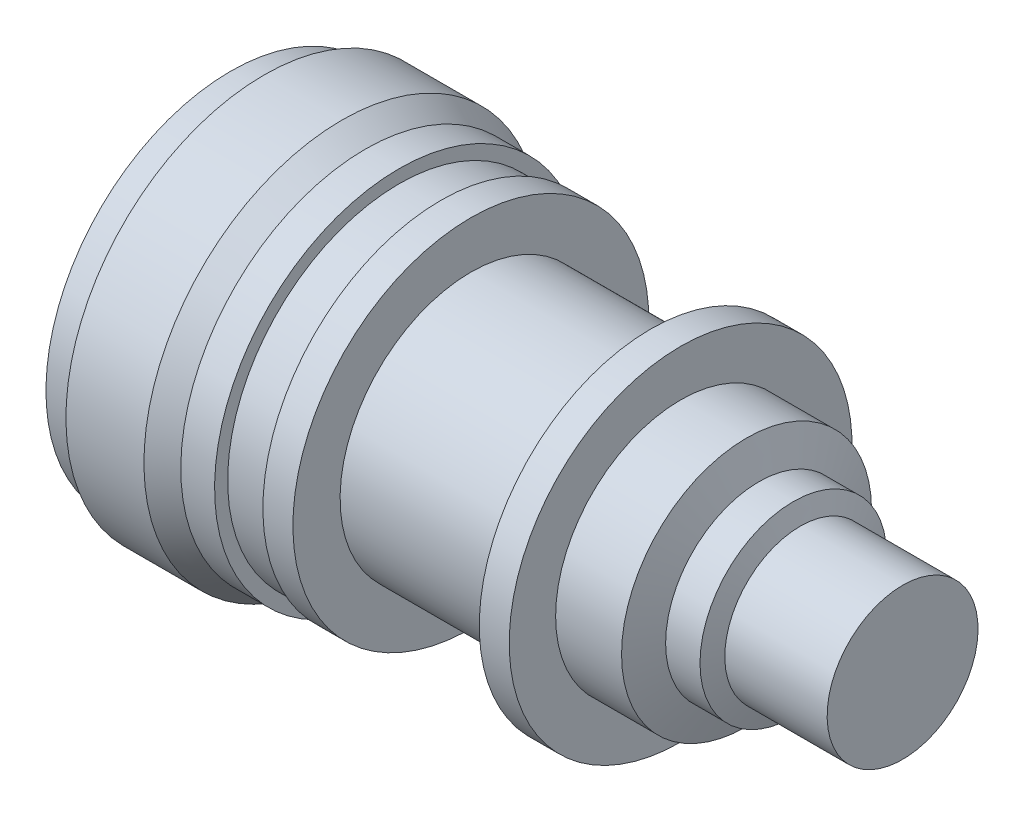
ISO-10303-21;
HEADER;
FILE_DESCRIPTION(('STEP AP214'),'2;1');
FILE_NAME('part.step','',(''),(''),'','','');
FILE_SCHEMA(('AUTOMOTIVE_DESIGN { 1 0 10303 214 1 1 1 1 }'));
ENDSEC;
DATA;
#1=APPLICATION_CONTEXT('core data for automotive mechanical design processes');
#2=APPLICATION_PROTOCOL_DEFINITION('international standard','automotive_design',2000,#1);
#3=PRODUCT_CONTEXT('',#1,'mechanical');
#4=PRODUCT('Part','Part','',(#3));
#5=PRODUCT_RELATED_PRODUCT_CATEGORY('part','',(#4));
#6=PRODUCT_DEFINITION_FORMATION('','',#4);
#7=PRODUCT_DEFINITION_CONTEXT('part definition',#1,'design');
#8=PRODUCT_DEFINITION('design','',#6,#7);
#9=PRODUCT_DEFINITION_SHAPE('','',#8);
#10=(LENGTH_UNIT() NAMED_UNIT(*) SI_UNIT(.MILLI.,.METRE.));
#11=(NAMED_UNIT(*) PLANE_ANGLE_UNIT() SI_UNIT($,.RADIAN.));
#12=(NAMED_UNIT(*) SI_UNIT($,.STERADIAN.) SOLID_ANGLE_UNIT());
#13=UNCERTAINTY_MEASURE_WITH_UNIT(LENGTH_MEASURE(1.E-05),#10,'distance_accuracy_value','');
#14=(GEOMETRIC_REPRESENTATION_CONTEXT(3) GLOBAL_UNCERTAINTY_ASSIGNED_CONTEXT((#13)) GLOBAL_UNIT_ASSIGNED_CONTEXT((#10,
#11,#12)) REPRESENTATION_CONTEXT('',''));
#15=CARTESIAN_POINT('',(0.,0.,0.));
#16=DIRECTION('',(0.,0.,1.));
#17=DIRECTION('',(1.,0.,0.));
#18=AXIS2_PLACEMENT_3D('',#15,#16,#17);
#19=CARTESIAN_POINT('',(187.727597644639,102.741789211819,0.));
#20=DIRECTION('',(-1.,0.,0.));
#21=DIRECTION('',(0.,-1.,0.));
#22=AXIS2_PLACEMENT_3D('',#19,#20,#21);
#23=PLANE('',#22);
#24=CARTESIAN_POINT('',(187.727597644639,102.741789211819,0.));
#25=DIRECTION('',(1.,0.,0.));
#26=DIRECTION('',(0.,1.,0.));
#27=AXIS2_PLACEMENT_3D('',#24,#25,#26);
#28=CIRCLE('',#27,11.2869143206888);
#29=CARTESIAN_POINT('',(187.727597644639,114.028703532508,0.));
#30=VERTEX_POINT('',#29);
#31=EDGE_CURVE('E10',#30,#30,#28,.T.);
#32=ORIENTED_EDGE('',*,*,#31,.F.);
#33=EDGE_LOOP('',(#32));
#34=FACE_BOUND('',#33,.T.);
#35=ADVANCED_FACE('F33',(#34),#23,.T.);
#36=CARTESIAN_POINT('',(241.707962768468,102.741789211819,0.));
#37=DIRECTION('',(1.,0.,0.));
#38=DIRECTION('',(0.,1.,0.));
#39=AXIS2_PLACEMENT_3D('',#36,#37,#38);
#40=CYLINDRICAL_SURFACE('',#39,11.2869143206888);
#41=ORIENTED_EDGE('',*,*,#31,.T.);
#42=EDGE_LOOP('',(#41));
#43=FACE_BOUND('',#42,.T.);
#44=CARTESIAN_POINT('',(189.775445954381,102.741789211819,0.));
#45=DIRECTION('',(1.,0.,0.));
#46=DIRECTION('',(0.,1.,0.));
#47=AXIS2_PLACEMENT_3D('',#44,#45,#46);
#48=CIRCLE('',#47,11.2869143206888);
#49=CARTESIAN_POINT('',(189.775445954381,114.028703532508,0.));
#50=VERTEX_POINT('',#49);
#51=EDGE_CURVE('E39',#50,#50,#48,.T.);
#52=ORIENTED_EDGE('',*,*,#51,.F.);
#53=EDGE_LOOP('',(#52));
#54=FACE_BOUND('',#53,.T.);
#55=ADVANCED_FACE('F117',(#43,#54),#40,.T.);
#56=CARTESIAN_POINT('',(189.775445954381,114.028703532508,0.));
#57=DIRECTION('',(-1.,0.,0.));
#58=DIRECTION('',(0.,-1.,0.));
#59=AXIS2_PLACEMENT_3D('',#56,#57,#58);
#60=PLANE('',#59);
#61=ORIENTED_EDGE('',*,*,#51,.T.);
#62=EDGE_LOOP('',(#61));
#63=FACE_BOUND('',#62,.T.);
#64=CARTESIAN_POINT('',(189.775445954381,102.741789211819,0.));
#65=DIRECTION('',(1.,0.,0.));
#66=DIRECTION('',(0.,1.,0.));
#67=AXIS2_PLACEMENT_3D('',#64,#65,#66);
#68=CIRCLE('',#67,12.1131931337101);
#69=CARTESIAN_POINT('',(189.775445954381,114.854982345529,0.));
#70=VERTEX_POINT('',#69);
#71=EDGE_CURVE('E43',#70,#70,#68,.T.);
#72=ORIENTED_EDGE('',*,*,#71,.F.);
#73=EDGE_LOOP('',(#72));
#74=FACE_BOUND('',#73,.T.);
#75=ADVANCED_FACE('F122',(#63,#74),#60,.T.);
#76=CARTESIAN_POINT('',(241.707962768468,102.741789211819,0.));
#77=DIRECTION('',(1.,0.,0.));
#78=DIRECTION('',(0.,1.,0.));
#79=AXIS2_PLACEMENT_3D('',#76,#77,#78);
#80=CYLINDRICAL_SURFACE('',#79,12.1131931337101);
#81=ORIENTED_EDGE('',*,*,#71,.T.);
#82=EDGE_LOOP('',(#81));
#83=FACE_BOUND('',#82,.T.);
#84=CARTESIAN_POINT('',(194.54787846046,102.741789211819,0.));
#85=DIRECTION('',(1.,0.,0.));
#86=DIRECTION('',(0.,1.,0.));
#87=AXIS2_PLACEMENT_3D('',#84,#85,#86);
#88=CIRCLE('',#87,12.1131931337101);
#89=CARTESIAN_POINT('',(194.54787846046,114.854982345529,0.));
#90=VERTEX_POINT('',#89);
#91=EDGE_CURVE('E47',#90,#90,#88,.T.);
#92=ORIENTED_EDGE('',*,*,#91,.F.);
#93=EDGE_LOOP('',(#92));
#94=FACE_BOUND('',#93,.T.);
#95=ADVANCED_FACE('F126',(#83,#94),#80,.T.);
#96=CARTESIAN_POINT('',(195.975850391413,102.741789211819,0.));
#97=DIRECTION('',(-1.,0.,0.));
#98=DIRECTION('',(0.,-1.,0.));
#99=AXIS2_PLACEMENT_3D('',#96,#97,#98);
#100=CONICAL_SURFACE('',#99,11.2869143206888,0.524564030367302);
#101=ORIENTED_EDGE('',*,*,#91,.T.);
#102=EDGE_LOOP('',(#101));
#103=FACE_BOUND('',#102,.T.);
#104=CARTESIAN_POINT('',(195.975850391413,102.741789211819,0.));
#105=DIRECTION('',(1.,0.,0.));
#106=DIRECTION('',(0.,1.,0.));
#107=AXIS2_PLACEMENT_3D('',#104,#105,#106);
#108=CIRCLE('',#107,11.2869143206888);
#109=CARTESIAN_POINT('',(195.975850391413,114.028703532508,0.));
#110=VERTEX_POINT('',#109);
#111=EDGE_CURVE('E52',#110,#110,#108,.T.);
#112=ORIENTED_EDGE('',*,*,#111,.F.);
#113=EDGE_LOOP('',(#112));
#114=FACE_BOUND('',#113,.T.);
#115=ADVANCED_FACE('F132',(#103,#114),#100,.T.);
#116=CARTESIAN_POINT('',(241.707962768468,102.741789211819,0.));
#117=DIRECTION('',(1.,0.,0.));
#118=DIRECTION('',(0.,1.,0.));
#119=AXIS2_PLACEMENT_3D('',#116,#117,#118);
#120=CYLINDRICAL_SURFACE('',#119,11.2869143206888);
#121=ORIENTED_EDGE('',*,*,#111,.T.);
#122=EDGE_LOOP('',(#121));
#123=FACE_BOUND('',#122,.T.);
#124=CARTESIAN_POINT('',(198.042651870424,102.741789211819,0.));
#125=DIRECTION('',(1.,0.,0.));
#126=DIRECTION('',(0.,1.,0.));
#127=AXIS2_PLACEMENT_3D('',#124,#125,#126);
#128=CIRCLE('',#127,11.2869143206888);
#129=CARTESIAN_POINT('',(198.042651870424,114.028703532508,0.));
#130=VERTEX_POINT('',#129);
#131=EDGE_CURVE('E55',#130,#130,#128,.T.);
#132=ORIENTED_EDGE('',*,*,#131,.F.);
#133=EDGE_LOOP('',(#132));
#134=FACE_BOUND('',#133,.T.);
#135=ADVANCED_FACE('F136',(#123,#134),#120,.T.);
#136=CARTESIAN_POINT('',(198.042651870424,114.028703532508,0.));
#137=DIRECTION('',(1.,0.,0.));
#138=DIRECTION('',(0.,1.,0.));
#139=AXIS2_PLACEMENT_3D('',#136,#137,#138);
#140=PLANE('',#139);
#141=ORIENTED_EDGE('',*,*,#131,.T.);
#142=EDGE_LOOP('',(#141));
#143=FACE_BOUND('',#142,.T.);
#144=CARTESIAN_POINT('',(198.042651870424,102.741789211819,0.));
#145=DIRECTION('',(1.,0.,0.));
#146=DIRECTION('',(0.,1.,0.));
#147=AXIS2_PLACEMENT_3D('',#144,#145,#146);
#148=CIRCLE('',#147,10.4859836389653);
#149=CARTESIAN_POINT('',(198.042651870424,113.227772850784,0.));
#150=VERTEX_POINT('',#149);
#151=EDGE_CURVE('E58',#150,#150,#148,.T.);
#152=ORIENTED_EDGE('',*,*,#151,.F.);
#153=EDGE_LOOP('',(#152));
#154=FACE_BOUND('',#153,.T.);
#155=ADVANCED_FACE('F140',(#143,#154),#140,.T.);
#156=CARTESIAN_POINT('',(241.707962768468,102.741789211819,0.));
#157=DIRECTION('',(1.,0.,0.));
#158=DIRECTION('',(0.,1.,0.));
#159=AXIS2_PLACEMENT_3D('',#156,#157,#158);
#160=CYLINDRICAL_SURFACE('',#159,10.4859836389653);
#161=ORIENTED_EDGE('',*,*,#151,.T.);
#162=EDGE_LOOP('',(#161));
#163=FACE_BOUND('',#162,.T.);
#164=CARTESIAN_POINT('',(200.597970062655,102.741789211819,0.));
#165=DIRECTION('',(1.,0.,0.));
#166=DIRECTION('',(0.,1.,0.));
#167=AXIS2_PLACEMENT_3D('',#164,#165,#166);
#168=CIRCLE('',#167,10.4859836389653);
#169=CARTESIAN_POINT('',(200.597970062655,113.227772850784,0.));
#170=VERTEX_POINT('',#169);
#171=EDGE_CURVE('E61',#170,#170,#168,.T.);
#172=ORIENTED_EDGE('',*,*,#171,.F.);
#173=EDGE_LOOP('',(#172));
#174=FACE_BOUND('',#173,.T.);
#175=ADVANCED_FACE('F144',(#163,#174),#160,.T.);
#176=CARTESIAN_POINT('',(200.597970062655,113.227772850784,0.));
#177=DIRECTION('',(-1.,0.,0.));
#178=DIRECTION('',(0.,-1.,0.));
#179=AXIS2_PLACEMENT_3D('',#176,#177,#178);
#180=PLANE('',#179);
#181=ORIENTED_EDGE('',*,*,#171,.T.);
#182=EDGE_LOOP('',(#181));
#183=FACE_BOUND('',#182,.T.);
#184=CARTESIAN_POINT('',(200.597970062655,102.741789211819,0.));
#185=DIRECTION('',(1.,0.,0.));
#186=DIRECTION('',(0.,1.,0.));
#187=AXIS2_PLACEMENT_3D('',#184,#185,#186);
#188=CIRCLE('',#187,10.8864489798271);
#189=CARTESIAN_POINT('',(200.597970062655,113.628238191646,0.));
#190=VERTEX_POINT('',#189);
#191=EDGE_CURVE('E64',#190,#190,#188,.T.);
#192=ORIENTED_EDGE('',*,*,#191,.F.);
#193=EDGE_LOOP('',(#192));
#194=FACE_BOUND('',#193,.T.);
#195=ADVANCED_FACE('F148',(#183,#194),#180,.T.);
#196=CARTESIAN_POINT('',(241.707962768468,102.741789211819,0.));
#197=DIRECTION('',(1.,0.,0.));
#198=DIRECTION('',(0.,1.,0.));
#199=AXIS2_PLACEMENT_3D('',#196,#197,#198);
#200=CYLINDRICAL_SURFACE('',#199,10.8864489798271);
#201=ORIENTED_EDGE('',*,*,#191,.T.);
#202=EDGE_LOOP('',(#201));
#203=FACE_BOUND('',#202,.T.);
#204=CARTESIAN_POINT('',(202.434218654705,102.741789211819,0.));
#205=DIRECTION('',(1.,0.,0.));
#206=DIRECTION('',(0.,1.,0.));
#207=AXIS2_PLACEMENT_3D('',#204,#205,#206);
#208=CIRCLE('',#207,10.8864489798271);
#209=CARTESIAN_POINT('',(202.434218654705,113.628238191646,0.));
#210=VERTEX_POINT('',#209);
#211=EDGE_CURVE('E67',#210,#210,#208,.T.);
#212=ORIENTED_EDGE('',*,*,#211,.F.);
#213=EDGE_LOOP('',(#212));
#214=FACE_BOUND('',#213,.T.);
#215=ADVANCED_FACE('F152',(#203,#214),#200,.T.);
#216=CARTESIAN_POINT('',(202.434218654705,113.628238191646,0.));
#217=DIRECTION('',(1.,0.,0.));
#218=DIRECTION('',(0.,1.,0.));
#219=AXIS2_PLACEMENT_3D('',#216,#217,#218);
#220=PLANE('',#219);
#221=ORIENTED_EDGE('',*,*,#211,.T.);
#222=EDGE_LOOP('',(#221));
#223=FACE_BOUND('',#222,.T.);
#224=CARTESIAN_POINT('',(202.434218654705,102.741789211819,0.));
#225=DIRECTION('',(1.,0.,0.));
#226=DIRECTION('',(0.,1.,0.));
#227=AXIS2_PLACEMENT_3D('',#224,#225,#226);
#228=CIRCLE('',#227,8.);
#229=CARTESIAN_POINT('',(202.434218654705,110.741789211819,0.));
#230=VERTEX_POINT('',#229);
#231=EDGE_CURVE('E70',#230,#230,#228,.T.);
#232=ORIENTED_EDGE('',*,*,#231,.F.);
#233=EDGE_LOOP('',(#232));
#234=FACE_BOUND('',#233,.T.);
#235=ADVANCED_FACE('F156',(#223,#234),#220,.T.);
#236=CARTESIAN_POINT('',(241.707962768468,102.741789211819,0.));
#237=DIRECTION('',(1.,0.,0.));
#238=DIRECTION('',(0.,1.,0.));
#239=AXIS2_PLACEMENT_3D('',#236,#237,#238);
#240=CYLINDRICAL_SURFACE('',#239,8.);
#241=ORIENTED_EDGE('',*,*,#231,.T.);
#242=EDGE_LOOP('',(#241));
#243=FACE_BOUND('',#242,.T.);
#244=CARTESIAN_POINT('',(213.434218654705,102.741789211819,0.));
#245=DIRECTION('',(1.,0.,0.));
#246=DIRECTION('',(0.,1.,0.));
#247=AXIS2_PLACEMENT_3D('',#244,#245,#246);
#248=CIRCLE('',#247,8.);
#249=CARTESIAN_POINT('',(213.434218654705,110.741789211819,0.));
#250=VERTEX_POINT('',#249);
#251=EDGE_CURVE('E73',#250,#250,#248,.T.);
#252=ORIENTED_EDGE('',*,*,#251,.F.);
#253=EDGE_LOOP('',(#252));
#254=FACE_BOUND('',#253,.T.);
#255=ADVANCED_FACE('F160',(#243,#254),#240,.T.);
#256=CARTESIAN_POINT('',(213.434218654705,110.741789211819,0.));
#257=DIRECTION('',(-1.,0.,0.));
#258=DIRECTION('',(0.,-1.,0.));
#259=AXIS2_PLACEMENT_3D('',#256,#257,#258);
#260=PLANE('',#259);
#261=ORIENTED_EDGE('',*,*,#251,.T.);
#262=EDGE_LOOP('',(#261));
#263=FACE_BOUND('',#262,.T.);
#264=CARTESIAN_POINT('',(213.434218654705,102.741789211819,0.));
#265=DIRECTION('',(1.,0.,0.));
#266=DIRECTION('',(0.,1.,0.));
#267=AXIS2_PLACEMENT_3D('',#264,#265,#266);
#268=CIRCLE('',#267,10.4859836389653);
#269=CARTESIAN_POINT('',(213.434218654705,113.227772850784,0.));
#270=VERTEX_POINT('',#269);
#271=EDGE_CURVE('E76',#270,#270,#268,.T.);
#272=ORIENTED_EDGE('',*,*,#271,.F.);
#273=EDGE_LOOP('',(#272));
#274=FACE_BOUND('',#273,.T.);
#275=ADVANCED_FACE('F164',(#263,#274),#260,.T.);
#276=CARTESIAN_POINT('',(241.707962768468,102.741789211819,0.));
#277=DIRECTION('',(1.,0.,0.));
#278=DIRECTION('',(0.,1.,0.));
#279=AXIS2_PLACEMENT_3D('',#276,#277,#278);
#280=CYLINDRICAL_SURFACE('',#279,10.4859836389653);
#281=ORIENTED_EDGE('',*,*,#271,.T.);
#282=EDGE_LOOP('',(#281));
#283=FACE_BOUND('',#282,.T.);
#284=CARTESIAN_POINT('',(215.265727925924,102.741789211819,0.));
#285=DIRECTION('',(1.,0.,0.));
#286=DIRECTION('',(0.,1.,0.));
#287=AXIS2_PLACEMENT_3D('',#284,#285,#286);
#288=CIRCLE('',#287,10.4859836389653);
#289=CARTESIAN_POINT('',(215.265727925924,113.227772850784,0.));
#290=VERTEX_POINT('',#289);
#291=EDGE_CURVE('E79',#290,#290,#288,.T.);
#292=ORIENTED_EDGE('',*,*,#291,.F.);
#293=EDGE_LOOP('',(#292));
#294=FACE_BOUND('',#293,.T.);
#295=ADVANCED_FACE('F168',(#283,#294),#280,.T.);
#296=CARTESIAN_POINT('',(215.265727925924,113.227772850784,0.));
#297=DIRECTION('',(1.,0.,0.));
#298=DIRECTION('',(0.,1.,0.));
#299=AXIS2_PLACEMENT_3D('',#296,#297,#298);
#300=PLANE('',#299);
#301=ORIENTED_EDGE('',*,*,#291,.T.);
#302=EDGE_LOOP('',(#301));
#303=FACE_BOUND('',#302,.T.);
#304=CARTESIAN_POINT('',(215.265727925924,102.741789211819,0.));
#305=DIRECTION('',(1.,0.,0.));
#306=DIRECTION('',(0.,1.,0.));
#307=AXIS2_PLACEMENT_3D('',#304,#305,#306);
#308=CIRCLE('',#307,7.64708460068381);
#309=CARTESIAN_POINT('',(215.265727925924,110.388873812503,0.));
#310=VERTEX_POINT('',#309);
#311=EDGE_CURVE('E82',#310,#310,#308,.T.);
#312=ORIENTED_EDGE('',*,*,#311,.F.);
#313=EDGE_LOOP('',(#312));
#314=FACE_BOUND('',#313,.T.);
#315=ADVANCED_FACE('F172',(#303,#314),#300,.T.);
#316=CARTESIAN_POINT('',(241.707962768468,102.741789211819,0.));
#317=DIRECTION('',(1.,0.,0.));
#318=DIRECTION('',(0.,1.,0.));
#319=AXIS2_PLACEMENT_3D('',#316,#317,#318);
#320=CYLINDRICAL_SURFACE('',#319,7.64708460068381);
#321=ORIENTED_EDGE('',*,*,#311,.T.);
#322=EDGE_LOOP('',(#321));
#323=FACE_BOUND('',#322,.T.);
#324=CARTESIAN_POINT('',(219.299066116859,102.741789211819,0.));
#325=DIRECTION('',(1.,0.,0.));
#326=DIRECTION('',(0.,1.,0.));
#327=AXIS2_PLACEMENT_3D('',#324,#325,#326);
#328=CIRCLE('',#327,7.64708460068381);
#329=CARTESIAN_POINT('',(219.299066116859,110.388873812503,0.));
#330=VERTEX_POINT('',#329);
#331=EDGE_CURVE('E85',#330,#330,#328,.T.);
#332=ORIENTED_EDGE('',*,*,#331,.F.);
#333=EDGE_LOOP('',(#332));
#334=FACE_BOUND('',#333,.T.);
#335=ADVANCED_FACE('F176',(#323,#334),#320,.T.);
#336=CARTESIAN_POINT('',(220.055017886958,102.741789211819,0.));
#337=DIRECTION('',(-1.,0.,0.));
#338=DIRECTION('',(0.,-1.,0.));
#339=AXIS2_PLACEMENT_3D('',#336,#337,#338);
#340=CONICAL_SURFACE('',#339,5.70790397303896,1.19908737667632);
#341=ORIENTED_EDGE('',*,*,#331,.T.);
#342=EDGE_LOOP('',(#341));
#343=FACE_BOUND('',#342,.T.);
#344=CARTESIAN_POINT('',(220.055017886958,102.741789211819,0.));
#345=DIRECTION('',(1.,0.,0.));
#346=DIRECTION('',(0.,1.,0.));
#347=AXIS2_PLACEMENT_3D('',#344,#345,#346);
#348=CIRCLE('',#347,5.70790397303896);
#349=CARTESIAN_POINT('',(220.055017886958,108.449693184858,0.));
#350=VERTEX_POINT('',#349);
#351=EDGE_CURVE('E88',#350,#350,#348,.T.);
#352=ORIENTED_EDGE('',*,*,#351,.F.);
#353=EDGE_LOOP('',(#352));
#354=FACE_BOUND('',#353,.T.);
#355=ADVANCED_FACE('F180',(#343,#354),#340,.T.);
#356=CARTESIAN_POINT('',(241.707962768468,102.741789211819,0.));
#357=DIRECTION('',(1.,0.,0.));
#358=DIRECTION('',(0.,1.,0.));
#359=AXIS2_PLACEMENT_3D('',#356,#357,#358);
#360=CYLINDRICAL_SURFACE('',#359,5.70790397303896);
#361=ORIENTED_EDGE('',*,*,#351,.T.);
#362=EDGE_LOOP('',(#361));
#363=FACE_BOUND('',#362,.T.);
#364=CARTESIAN_POINT('',(222.158535855929,102.741789211819,0.));
#365=DIRECTION('',(1.,0.,0.));
#366=DIRECTION('',(0.,1.,0.));
#367=AXIS2_PLACEMENT_3D('',#364,#365,#366);
#368=CIRCLE('',#367,5.70790397303896);
#369=CARTESIAN_POINT('',(222.158535855929,108.449693184858,0.));
#370=VERTEX_POINT('',#369);
#371=EDGE_CURVE('E91',#370,#370,#368,.T.);
#372=ORIENTED_EDGE('',*,*,#371,.F.);
#373=EDGE_LOOP('',(#372));
#374=FACE_BOUND('',#373,.T.);
#375=ADVANCED_FACE('F113',(#363,#374),#360,.T.);
#376=CARTESIAN_POINT('',(222.584256132984,102.741789211819,0.));
#377=DIRECTION('',(-1.,0.,0.));
#378=DIRECTION('',(0.,-1.,0.));
#379=AXIS2_PLACEMENT_3D('',#376,#377,#378);
#380=CONICAL_SURFACE('',#379,4.61583891450641,1.19908737667631);
#381=ORIENTED_EDGE('',*,*,#371,.T.);
#382=EDGE_LOOP('',(#381));
#383=FACE_BOUND('',#382,.T.);
#384=CARTESIAN_POINT('',(222.584256132984,102.741789211819,0.));
#385=DIRECTION('',(1.,0.,0.));
#386=DIRECTION('',(0.,1.,0.));
#387=AXIS2_PLACEMENT_3D('',#384,#385,#386);
#388=CIRCLE('',#387,4.61583891450642);
#389=CARTESIAN_POINT('',(222.584256132984,107.357628126326,0.));
#390=VERTEX_POINT('',#389);
#391=EDGE_CURVE('E94',#390,#390,#388,.T.);
#392=ORIENTED_EDGE('',*,*,#391,.F.);
#393=EDGE_LOOP('',(#392));
#394=FACE_BOUND('',#393,.T.);
#395=ADVANCED_FACE('F105',(#383,#394),#380,.T.);
#396=CARTESIAN_POINT('',(241.707962768468,102.741789211819,0.));
#397=DIRECTION('',(1.,0.,0.));
#398=DIRECTION('',(0.,1.,0.));
#399=AXIS2_PLACEMENT_3D('',#396,#397,#398);
#400=CYLINDRICAL_SURFACE('',#399,4.6158389145064);
#401=ORIENTED_EDGE('',*,*,#391,.T.);
#402=EDGE_LOOP('',(#401));
#403=FACE_BOUND('',#402,.T.);
#404=CARTESIAN_POINT('',(228.843550949137,102.741789211819,0.));
#405=DIRECTION('',(1.,0.,0.));
#406=DIRECTION('',(0.,1.,0.));
#407=AXIS2_PLACEMENT_3D('',#404,#405,#406);
#408=CIRCLE('',#407,4.6158389145064);
#409=CARTESIAN_POINT('',(228.843550949137,107.357628126326,0.));
#410=VERTEX_POINT('',#409);
#411=EDGE_CURVE('E97',#410,#410,#408,.T.);
#412=ORIENTED_EDGE('',*,*,#411,.F.);
#413=EDGE_LOOP('',(#412));
#414=FACE_BOUND('',#413,.T.);
#415=ADVANCED_FACE('F103',(#403,#414),#400,.T.);
#416=CARTESIAN_POINT('',(228.843550949137,107.357628126326,0.));
#417=DIRECTION('',(1.,0.,0.));
#418=DIRECTION('',(0.,1.,0.));
#419=AXIS2_PLACEMENT_3D('',#416,#417,#418);
#420=PLANE('',#419);
#421=ORIENTED_EDGE('',*,*,#411,.T.);
#422=EDGE_LOOP('',(#421));
#423=FACE_BOUND('',#422,.T.);
#424=ADVANCED_FACE('F101',(#423),#420,.T.);
#425=CLOSED_SHELL('',(#35,#55,#75,#95,#115,#135,#155,#175,#195,#215,#235,#255,#275,#295,#315,
#335,#355,#375,#395,#415,#424));
#426=MANIFOLD_SOLID_BREP('B2',#425);
#427=ADVANCED_BREP_SHAPE_REPRESENTATION('',(#18,#426),#14);
#428=SHAPE_DEFINITION_REPRESENTATION(#9,#427);
ENDSEC;
END-ISO-10303-21;
